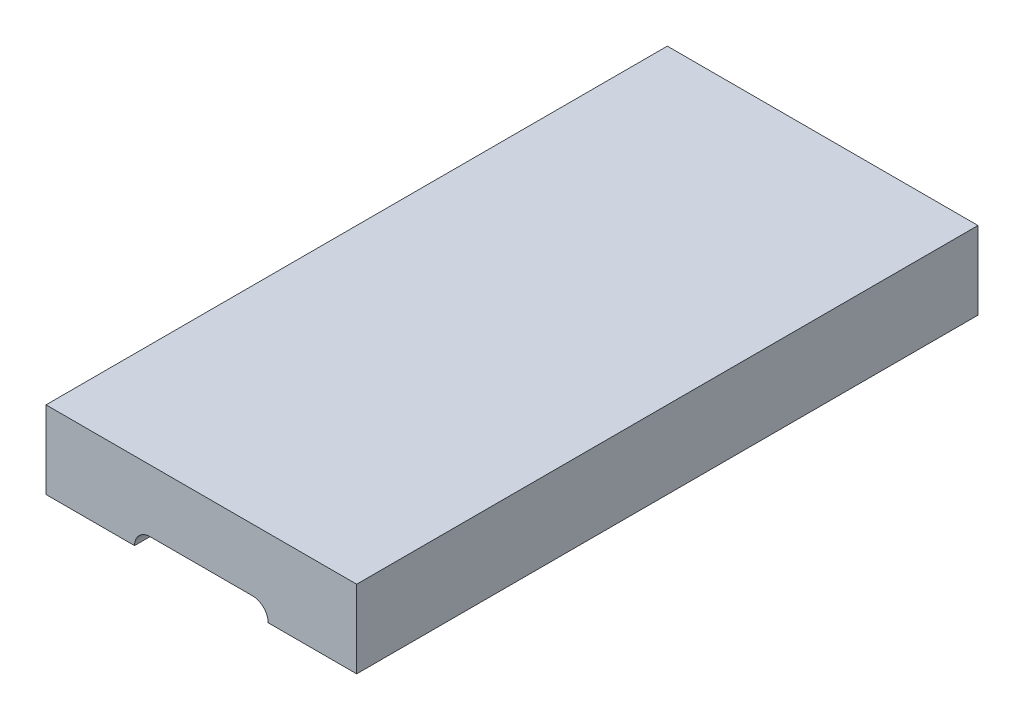
ISO-10303-21;
HEADER;
FILE_DESCRIPTION(('STEP AP214'),'2;1');
FILE_NAME('part.step','',(''),(''),'','','');
FILE_SCHEMA(('AUTOMOTIVE_DESIGN { 1 0 10303 214 1 1 1 1 }'));
ENDSEC;
DATA;
#1=APPLICATION_CONTEXT('core data for automotive mechanical design processes');
#2=APPLICATION_PROTOCOL_DEFINITION('international standard','automotive_design',2000,#1);
#3=PRODUCT_CONTEXT('',#1,'mechanical');
#4=PRODUCT('Part','Part','',(#3));
#5=PRODUCT_RELATED_PRODUCT_CATEGORY('part','',(#4));
#6=PRODUCT_DEFINITION_FORMATION('','',#4);
#7=PRODUCT_DEFINITION_CONTEXT('part definition',#1,'design');
#8=PRODUCT_DEFINITION('design','',#6,#7);
#9=PRODUCT_DEFINITION_SHAPE('','',#8);
#10=(LENGTH_UNIT() NAMED_UNIT(*) SI_UNIT(.MILLI.,.METRE.));
#11=(NAMED_UNIT(*) PLANE_ANGLE_UNIT() SI_UNIT($,.RADIAN.));
#12=(NAMED_UNIT(*) SI_UNIT($,.STERADIAN.) SOLID_ANGLE_UNIT());
#13=UNCERTAINTY_MEASURE_WITH_UNIT(LENGTH_MEASURE(1.E-05),#10,'distance_accuracy_value','');
#14=(GEOMETRIC_REPRESENTATION_CONTEXT(3) GLOBAL_UNCERTAINTY_ASSIGNED_CONTEXT((#13)) GLOBAL_UNIT_ASSIGNED_CONTEXT((#10,
#11,#12)) REPRESENTATION_CONTEXT('',''));
#15=CARTESIAN_POINT('',(0.,0.,0.));
#16=DIRECTION('',(0.,0.,1.));
#17=DIRECTION('',(1.,0.,0.));
#18=AXIS2_PLACEMENT_3D('',#15,#16,#17);
#19=CARTESIAN_POINT('',(8.509,7.62,-50.8));
#20=DIRECTION('',(0.,-1.,0.));
#21=DIRECTION('',(1.,0.,0.));
#22=AXIS2_PLACEMENT_3D('',#19,#20,#21);
#23=PLANE('',#22);
#24=DIRECTION('',(-1.,0.,0.));
#25=VECTOR('',#24,1.);
#26=CARTESIAN_POINT('',(2.54,7.62,-2.54));
#27=LINE('',#26,#25);
#28=CARTESIAN_POINT('',(16.891,7.62,-2.54));
#29=VERTEX_POINT('',#28);
#30=CARTESIAN_POINT('',(8.509,7.62,-2.54));
#31=VERTEX_POINT('',#30);
#32=EDGE_CURVE('E172',#29,#31,#27,.T.);
#33=ORIENTED_EDGE('',*,*,#32,.F.);
#34=DIRECTION('',(0.,0.,1.));
#35=VECTOR('',#34,1.);
#36=CARTESIAN_POINT('',(16.891,7.62,-50.8));
#37=LINE('',#36,#35);
#38=CARTESIAN_POINT('',(16.891,7.62,0.));
#39=VERTEX_POINT('',#38);
#40=EDGE_CURVE('E232',#29,#39,#37,.T.);
#41=ORIENTED_EDGE('',*,*,#40,.T.);
#42=DIRECTION('',(1.,0.,0.));
#43=VECTOR('',#42,1.);
#44=CARTESIAN_POINT('',(8.509,7.62,0.));
#45=LINE('',#44,#43);
#46=CARTESIAN_POINT('',(8.509,7.62,0.));
#47=VERTEX_POINT('',#46);
#48=EDGE_CURVE('E225',#47,#39,#45,.T.);
#49=ORIENTED_EDGE('',*,*,#48,.F.);
#50=DIRECTION('',(0.,0.,1.));
#51=VECTOR('',#50,1.);
#52=CARTESIAN_POINT('',(8.509,7.62,-50.8));
#53=LINE('',#52,#51);
#54=EDGE_CURVE('E248',#31,#47,#53,.T.);
#55=ORIENTED_EDGE('',*,*,#54,.F.);
#56=EDGE_LOOP('',(#33,#41,#49,#55));
#57=FACE_BOUND('',#56,.T.);
#58=ADVANCED_FACE('F38',(#57),#23,.T.);
#59=CARTESIAN_POINT('',(0.,0.,-50.8));
#60=DIRECTION('',(-1.,0.,0.));
#61=DIRECTION('',(0.,0.,1.));
#62=AXIS2_PLACEMENT_3D('',#59,#60,#61);
#63=PLANE('',#62);
#64=DIRECTION('',(0.,0.,1.));
#65=VECTOR('',#64,1.);
#66=CARTESIAN_POINT('',(0.,6.35,0.));
#67=LINE('',#66,#65);
#68=CARTESIAN_POINT('',(0.,6.35,-50.8));
#69=VERTEX_POINT('',#68);
#70=CARTESIAN_POINT('',(0.,6.35,0.));
#71=VERTEX_POINT('',#70);
#72=EDGE_CURVE('E202',#69,#71,#67,.T.);
#73=ORIENTED_EDGE('',*,*,#72,.T.);
#74=DIRECTION('',(0.,-1.,0.));
#75=VECTOR('',#74,1.);
#76=CARTESIAN_POINT('',(0.,0.,0.));
#77=LINE('',#76,#75);
#78=CARTESIAN_POINT('',(0.,12.7,0.));
#79=VERTEX_POINT('',#78);
#80=EDGE_CURVE('E247',#79,#71,#77,.T.);
#81=ORIENTED_EDGE('',*,*,#80,.F.);
#82=DIRECTION('',(0.,0.,1.));
#83=VECTOR('',#82,1.);
#84=CARTESIAN_POINT('',(0.,12.7,-50.8));
#85=LINE('',#84,#83);
#86=CARTESIAN_POINT('',(0.,12.7,-50.8));
#87=VERTEX_POINT('',#86);
#88=EDGE_CURVE('E47',#87,#79,#85,.T.);
#89=ORIENTED_EDGE('',*,*,#88,.F.);
#90=DIRECTION('',(0.,-1.,0.));
#91=VECTOR('',#90,1.);
#92=CARTESIAN_POINT('',(0.,0.,-50.8));
#93=LINE('',#92,#91);
#94=EDGE_CURVE('E254',#87,#69,#93,.T.);
#95=ORIENTED_EDGE('',*,*,#94,.T.);
#96=EDGE_LOOP('',(#73,#81,#89,#95));
#97=FACE_BOUND('',#96,.T.);
#98=ADVANCED_FACE('F40',(#97),#63,.T.);
#99=CARTESIAN_POINT('',(0.,12.7,-50.8));
#100=DIRECTION('',(0.,1.,0.));
#101=DIRECTION('',(0.,0.,1.));
#102=AXIS2_PLACEMENT_3D('',#99,#100,#101);
#103=PLANE('',#102);
#104=DIRECTION('',(-1.,0.,0.));
#105=VECTOR('',#104,1.);
#106=CARTESIAN_POINT('',(0.,12.7,0.));
#107=LINE('',#106,#105);
#108=CARTESIAN_POINT('',(25.4,12.7,0.));
#109=VERTEX_POINT('',#108);
#110=EDGE_CURVE('E259',#109,#79,#107,.T.);
#111=ORIENTED_EDGE('',*,*,#110,.F.);
#112=DIRECTION('',(0.,0.,1.));
#113=VECTOR('',#112,1.);
#114=CARTESIAN_POINT('',(25.4,12.7,-50.8));
#115=LINE('',#114,#113);
#116=CARTESIAN_POINT('',(25.4,12.7,-50.8));
#117=VERTEX_POINT('',#116);
#118=EDGE_CURVE('E266',#117,#109,#115,.T.);
#119=ORIENTED_EDGE('',*,*,#118,.F.);
#120=DIRECTION('',(-1.,0.,0.));
#121=VECTOR('',#120,1.);
#122=CARTESIAN_POINT('',(0.,12.7,-50.8));
#123=LINE('',#122,#121);
#124=EDGE_CURVE('E262',#117,#87,#123,.T.);
#125=ORIENTED_EDGE('',*,*,#124,.T.);
#126=ORIENTED_EDGE('',*,*,#88,.T.);
#127=EDGE_LOOP('',(#111,#119,#125,#126));
#128=FACE_BOUND('',#127,.T.);
#129=ADVANCED_FACE('F288',(#128),#103,.T.);
#130=CARTESIAN_POINT('',(25.4,0.,-50.8));
#131=DIRECTION('',(1.,0.,0.));
#132=DIRECTION('',(0.,0.,-1.));
#133=AXIS2_PLACEMENT_3D('',#130,#131,#132);
#134=PLANE('',#133);
#135=DIRECTION('',(0.,0.,1.));
#136=VECTOR('',#135,1.);
#137=CARTESIAN_POINT('',(25.4,6.35,0.));
#138=LINE('',#137,#136);
#139=CARTESIAN_POINT('',(25.4,6.35,-50.8));
#140=VERTEX_POINT('',#139);
#141=CARTESIAN_POINT('',(25.4,6.35,0.));
#142=VERTEX_POINT('',#141);
#143=EDGE_CURVE('E201',#140,#142,#138,.T.);
#144=ORIENTED_EDGE('',*,*,#143,.F.);
#145=DIRECTION('',(0.,1.,0.));
#146=VECTOR('',#145,1.);
#147=CARTESIAN_POINT('',(25.4,0.,-50.8));
#148=LINE('',#147,#146);
#149=EDGE_CURVE('E258',#140,#117,#148,.T.);
#150=ORIENTED_EDGE('',*,*,#149,.T.);
#151=ORIENTED_EDGE('',*,*,#118,.T.);
#152=DIRECTION('',(0.,1.,0.));
#153=VECTOR('',#152,1.);
#154=CARTESIAN_POINT('',(25.4,0.,0.));
#155=LINE('',#154,#153);
#156=EDGE_CURVE('E270',#142,#109,#155,.T.);
#157=ORIENTED_EDGE('',*,*,#156,.F.);
#158=EDGE_LOOP('',(#144,#150,#151,#157));
#159=FACE_BOUND('',#158,.T.);
#160=ADVANCED_FACE('F284',(#159),#134,.T.);
#161=CARTESIAN_POINT('',(0.,0.,-50.8));
#162=DIRECTION('',(0.,0.,-1.));
#163=DIRECTION('',(-1.,0.,0.));
#164=AXIS2_PLACEMENT_3D('',#161,#162,#163);
#165=PLANE('',#164);
#166=DIRECTION('',(1.,0.,0.));
#167=VECTOR('',#166,1.);
#168=CARTESIAN_POINT('',(0.,6.35,-50.8));
#169=LINE('',#168,#167);
#170=CARTESIAN_POINT('',(7.239,6.35,-50.8));
#171=VERTEX_POINT('',#170);
#172=EDGE_CURVE('E62',#69,#171,#169,.T.);
#173=ORIENTED_EDGE('',*,*,#172,.F.);
#174=ORIENTED_EDGE('',*,*,#94,.F.);
#175=ORIENTED_EDGE('',*,*,#124,.F.);
#176=ORIENTED_EDGE('',*,*,#149,.F.);
#177=CARTESIAN_POINT('',(18.161,6.35,-50.8));
#178=VERTEX_POINT('',#177);
#179=EDGE_CURVE('E206',#178,#140,#169,.T.);
#180=ORIENTED_EDGE('',*,*,#179,.F.);
#181=CARTESIAN_POINT('',(16.891,6.35,-50.8));
#182=DIRECTION('',(0.,0.,1.));
#183=DIRECTION('',(1.,0.,0.));
#184=AXIS2_PLACEMENT_3D('',#181,#182,#183);
#185=CIRCLE('',#184,1.27);
#186=CARTESIAN_POINT('',(16.891,7.62,-50.8));
#187=VERTEX_POINT('',#186);
#188=EDGE_CURVE('E224',#178,#187,#185,.T.);
#189=ORIENTED_EDGE('',*,*,#188,.T.);
#190=DIRECTION('',(1.,0.,0.));
#191=VECTOR('',#190,1.);
#192=CARTESIAN_POINT('',(8.509,7.62,-50.8));
#193=LINE('',#192,#191);
#194=CARTESIAN_POINT('',(8.509,7.62,-50.8));
#195=VERTEX_POINT('',#194);
#196=EDGE_CURVE('E228',#195,#187,#193,.T.);
#197=ORIENTED_EDGE('',*,*,#196,.F.);
#198=CARTESIAN_POINT('',(8.509,6.35,-50.8));
#199=DIRECTION('',(0.,0.,1.));
#200=DIRECTION('',(1.,0.,0.));
#201=AXIS2_PLACEMENT_3D('',#198,#199,#200);
#202=CIRCLE('',#201,1.27);
#203=EDGE_CURVE('E220',#195,#171,#202,.T.);
#204=ORIENTED_EDGE('',*,*,#203,.T.);
#205=EDGE_LOOP('',(#173,#174,#175,#176,#180,#189,#197,#204));
#206=FACE_BOUND('',#205,.T.);
#207=ADVANCED_FACE('F301',(#206),#165,.T.);
#208=CARTESIAN_POINT('',(0.,0.,0.));
#209=DIRECTION('',(0.,0.,-1.));
#210=DIRECTION('',(-1.,0.,0.));
#211=AXIS2_PLACEMENT_3D('',#208,#209,#210);
#212=PLANE('',#211);
#213=ORIENTED_EDGE('',*,*,#80,.T.);
#214=DIRECTION('',(1.,0.,0.));
#215=VECTOR('',#214,1.);
#216=CARTESIAN_POINT('',(0.,6.35,0.));
#217=LINE('',#216,#215);
#218=CARTESIAN_POINT('',(7.239,6.35,0.));
#219=VERTEX_POINT('',#218);
#220=EDGE_CURVE('E209',#71,#219,#217,.T.);
#221=ORIENTED_EDGE('',*,*,#220,.T.);
#222=CARTESIAN_POINT('',(8.509,6.35,0.));
#223=DIRECTION('',(0.,0.,1.));
#224=DIRECTION('',(1.,0.,0.));
#225=AXIS2_PLACEMENT_3D('',#222,#223,#224);
#226=CIRCLE('',#225,1.27);
#227=EDGE_CURVE('E219',#47,#219,#226,.T.);
#228=ORIENTED_EDGE('',*,*,#227,.F.);
#229=ORIENTED_EDGE('',*,*,#48,.T.);
#230=CARTESIAN_POINT('',(16.891,6.35,0.));
#231=DIRECTION('',(0.,0.,1.));
#232=DIRECTION('',(1.,0.,0.));
#233=AXIS2_PLACEMENT_3D('',#230,#231,#232);
#234=CIRCLE('',#233,1.27);
#235=CARTESIAN_POINT('',(18.161,6.35,0.));
#236=VERTEX_POINT('',#235);
#237=EDGE_CURVE('E236',#236,#39,#234,.T.);
#238=ORIENTED_EDGE('',*,*,#237,.F.);
#239=EDGE_CURVE('E214',#236,#142,#217,.T.);
#240=ORIENTED_EDGE('',*,*,#239,.T.);
#241=ORIENTED_EDGE('',*,*,#156,.T.);
#242=ORIENTED_EDGE('',*,*,#110,.T.);
#243=EDGE_LOOP('',(#213,#221,#228,#229,#238,#240,#241,#242));
#244=FACE_BOUND('',#243,.T.);
#245=ADVANCED_FACE('F291',(#244),#212,.F.);
#246=CARTESIAN_POINT('',(8.509,6.35,-50.8));
#247=DIRECTION('',(0.,0.,1.));
#248=DIRECTION('',(1.,0.,0.));
#249=AXIS2_PLACEMENT_3D('',#246,#247,#248);
#250=CYLINDRICAL_SURFACE('',#249,1.27);
#251=ORIENTED_EDGE('',*,*,#227,.T.);
#252=DIRECTION('',(0.,0.,1.));
#253=VECTOR('',#252,1.);
#254=CARTESIAN_POINT('',(7.239,6.35,-50.8));
#255=LINE('',#254,#253);
#256=EDGE_CURVE('E213',#219,#171,#255,.F.);
#257=ORIENTED_EDGE('',*,*,#256,.T.);
#258=ORIENTED_EDGE('',*,*,#203,.F.);
#259=CARTESIAN_POINT('',(8.509,7.62,-48.26));
#260=VERTEX_POINT('',#259);
#261=EDGE_CURVE('E243',#195,#260,#53,.T.);
#262=ORIENTED_EDGE('',*,*,#261,.T.);
#263=DIRECTION('',(0.,0.,1.));
#264=VECTOR('',#263,1.);
#265=CARTESIAN_POINT('',(8.509,7.62,-50.8));
#266=LINE('',#265,#264);
#267=EDGE_CURVE('E193',#31,#260,#266,.F.);
#268=ORIENTED_EDGE('',*,*,#267,.F.);
#269=ORIENTED_EDGE('',*,*,#54,.T.);
#270=EDGE_LOOP('',(#251,#257,#258,#262,#268,#269));
#271=FACE_BOUND('',#270,.T.);
#272=ADVANCED_FACE('F307',(#271),#250,.F.);
#273=DIRECTION('',(1.,0.,0.));
#274=VECTOR('',#273,1.);
#275=CARTESIAN_POINT('',(2.54000000000001,7.62,-48.26));
#276=LINE('',#275,#274);
#277=CARTESIAN_POINT('',(16.891,7.62,-48.26));
#278=VERTEX_POINT('',#277);
#279=EDGE_CURVE('E54',#260,#278,#276,.T.);
#280=ORIENTED_EDGE('',*,*,#279,.F.);
#281=ORIENTED_EDGE('',*,*,#261,.F.);
#282=ORIENTED_EDGE('',*,*,#196,.T.);
#283=EDGE_CURVE('E249',#187,#278,#37,.T.);
#284=ORIENTED_EDGE('',*,*,#283,.T.);
#285=EDGE_LOOP('',(#280,#281,#282,#284));
#286=FACE_BOUND('',#285,.T.);
#287=ADVANCED_FACE('F324',(#286),#23,.T.);
#288=CARTESIAN_POINT('',(16.891,6.35,-50.8));
#289=DIRECTION('',(0.,0.,1.));
#290=DIRECTION('',(1.,0.,0.));
#291=AXIS2_PLACEMENT_3D('',#288,#289,#290);
#292=CYLINDRICAL_SURFACE('',#291,1.27);
#293=ORIENTED_EDGE('',*,*,#188,.F.);
#294=DIRECTION('',(0.,0.,1.));
#295=VECTOR('',#294,1.);
#296=CARTESIAN_POINT('',(18.161,6.35,-50.8));
#297=LINE('',#296,#295);
#298=EDGE_CURVE('E11',#178,#236,#297,.T.);
#299=ORIENTED_EDGE('',*,*,#298,.T.);
#300=ORIENTED_EDGE('',*,*,#237,.T.);
#301=ORIENTED_EDGE('',*,*,#40,.F.);
#302=EDGE_CURVE('E253',#278,#29,#37,.T.);
#303=ORIENTED_EDGE('',*,*,#302,.F.);
#304=ORIENTED_EDGE('',*,*,#283,.F.);
#305=EDGE_LOOP('',(#293,#299,#300,#301,#303,#304));
#306=FACE_BOUND('',#305,.T.);
#307=ADVANCED_FACE('F320',(#306),#292,.F.);
#308=CARTESIAN_POINT('',(0.,6.35,0.));
#309=DIRECTION('',(0.,1.,0.));
#310=DIRECTION('',(0.,0.,1.));
#311=AXIS2_PLACEMENT_3D('',#308,#309,#310);
#312=PLANE('',#311);
#313=ORIENTED_EDGE('',*,*,#179,.T.);
#314=ORIENTED_EDGE('',*,*,#143,.T.);
#315=ORIENTED_EDGE('',*,*,#239,.F.);
#316=ORIENTED_EDGE('',*,*,#298,.F.);
#317=EDGE_LOOP('',(#313,#314,#315,#316));
#318=FACE_BOUND('',#317,.T.);
#319=ADVANCED_FACE('F298',(#318),#312,.F.);
#320=ORIENTED_EDGE('',*,*,#220,.F.);
#321=ORIENTED_EDGE('',*,*,#72,.F.);
#322=ORIENTED_EDGE('',*,*,#172,.T.);
#323=ORIENTED_EDGE('',*,*,#256,.F.);
#324=EDGE_LOOP('',(#320,#321,#322,#323));
#325=FACE_BOUND('',#324,.T.);
#326=ADVANCED_FACE('F304',(#325),#312,.F.);
#327=CARTESIAN_POINT('',(0.,7.62,0.));
#328=DIRECTION('',(0.,-1.,0.));
#329=DIRECTION('',(1.,0.,0.));
#330=AXIS2_PLACEMENT_3D('',#327,#328,#329);
#331=PLANE('',#330);
#332=CARTESIAN_POINT('',(22.86,7.62,-2.54));
#333=VERTEX_POINT('',#332);
#334=EDGE_CURVE('E168',#333,#29,#27,.T.);
#335=ORIENTED_EDGE('',*,*,#334,.F.);
#336=DIRECTION('',(0.,0.,1.));
#337=VECTOR('',#336,1.);
#338=CARTESIAN_POINT('',(22.86,7.62,-2.54));
#339=LINE('',#338,#337);
#340=CARTESIAN_POINT('',(22.86,7.62,-48.26));
#341=VERTEX_POINT('',#340);
#342=EDGE_CURVE('E186',#341,#333,#339,.T.);
#343=ORIENTED_EDGE('',*,*,#342,.F.);
#344=EDGE_CURVE('E182',#278,#341,#276,.T.);
#345=ORIENTED_EDGE('',*,*,#344,.F.);
#346=ORIENTED_EDGE('',*,*,#302,.T.);
#347=EDGE_LOOP('',(#335,#343,#345,#346));
#348=FACE_BOUND('',#347,.T.);
#349=ADVANCED_FACE('F332',(#348),#331,.F.);
#350=CARTESIAN_POINT('',(2.54,11.43,-2.54));
#351=DIRECTION('',(-1.,0.,0.));
#352=DIRECTION('',(0.,-1.,0.));
#353=AXIS2_PLACEMENT_3D('',#350,#351,#352);
#354=PLANE('',#353);
#355=DIRECTION('',(0.,0.,-1.));
#356=VECTOR('',#355,1.);
#357=CARTESIAN_POINT('',(2.54,7.62,-2.54));
#358=LINE('',#357,#356);
#359=CARTESIAN_POINT('',(2.54,7.62,-2.54));
#360=VERTEX_POINT('',#359);
#361=CARTESIAN_POINT('',(2.54000000000001,7.62,-48.26));
#362=VERTEX_POINT('',#361);
#363=EDGE_CURVE('E149',#360,#362,#358,.T.);
#364=ORIENTED_EDGE('',*,*,#363,.T.);
#365=DIRECTION('',(0.,-1.,0.));
#366=VECTOR('',#365,1.);
#367=CARTESIAN_POINT('',(2.54,11.43,-48.26));
#368=LINE('',#367,#366);
#369=CARTESIAN_POINT('',(2.54,11.43,-48.26));
#370=VERTEX_POINT('',#369);
#371=EDGE_CURVE('E141',#370,#362,#368,.T.);
#372=ORIENTED_EDGE('',*,*,#371,.F.);
#373=DIRECTION('',(0.,0.,-1.));
#374=VECTOR('',#373,1.);
#375=CARTESIAN_POINT('',(2.54,11.43,-2.54));
#376=LINE('',#375,#374);
#377=CARTESIAN_POINT('',(2.54,11.43,-2.54));
#378=VERTEX_POINT('',#377);
#379=EDGE_CURVE('E146',#378,#370,#376,.T.);
#380=ORIENTED_EDGE('',*,*,#379,.F.);
#381=DIRECTION('',(0.,-1.,0.));
#382=VECTOR('',#381,1.);
#383=CARTESIAN_POINT('',(2.54,11.43,-2.54));
#384=LINE('',#383,#382);
#385=EDGE_CURVE('E190',#378,#360,#384,.T.);
#386=ORIENTED_EDGE('',*,*,#385,.T.);
#387=EDGE_LOOP('',(#364,#372,#380,#386));
#388=FACE_BOUND('',#387,.T.);
#389=ADVANCED_FACE('F143',(#388),#354,.F.);
#390=CARTESIAN_POINT('',(2.54,11.43,-2.54));
#391=DIRECTION('',(0.,0.,1.));
#392=DIRECTION('',(1.,0.,0.));
#393=AXIS2_PLACEMENT_3D('',#390,#391,#392);
#394=PLANE('',#393);
#395=ORIENTED_EDGE('',*,*,#334,.T.);
#396=ORIENTED_EDGE('',*,*,#32,.T.);
#397=EDGE_CURVE('E174',#31,#360,#27,.T.);
#398=ORIENTED_EDGE('',*,*,#397,.T.);
#399=ORIENTED_EDGE('',*,*,#385,.F.);
#400=DIRECTION('',(-1.,0.,0.));
#401=VECTOR('',#400,1.);
#402=CARTESIAN_POINT('',(2.54,11.43,-2.54));
#403=LINE('',#402,#401);
#404=CARTESIAN_POINT('',(22.86,11.43,-2.54));
#405=VERTEX_POINT('',#404);
#406=EDGE_CURVE('E153',#405,#378,#403,.T.);
#407=ORIENTED_EDGE('',*,*,#406,.F.);
#408=DIRECTION('',(0.,-1.,0.));
#409=VECTOR('',#408,1.);
#410=CARTESIAN_POINT('',(22.86,11.43,-2.54));
#411=LINE('',#410,#409);
#412=EDGE_CURVE('E194',#405,#333,#411,.T.);
#413=ORIENTED_EDGE('',*,*,#412,.T.);
#414=EDGE_LOOP('',(#395,#396,#398,#399,#407,#413));
#415=FACE_BOUND('',#414,.T.);
#416=ADVANCED_FACE('F334',(#415),#394,.F.);
#417=CARTESIAN_POINT('',(22.86,11.43,-2.54));
#418=DIRECTION('',(1.,0.,0.));
#419=DIRECTION('',(0.,1.,0.));
#420=AXIS2_PLACEMENT_3D('',#417,#418,#419);
#421=PLANE('',#420);
#422=ORIENTED_EDGE('',*,*,#342,.T.);
#423=ORIENTED_EDGE('',*,*,#412,.F.);
#424=DIRECTION('',(0.,0.,1.));
#425=VECTOR('',#424,1.);
#426=CARTESIAN_POINT('',(22.86,11.43,-2.54));
#427=LINE('',#426,#425);
#428=CARTESIAN_POINT('',(22.86,11.43,-48.26));
#429=VERTEX_POINT('',#428);
#430=EDGE_CURVE('E163',#429,#405,#427,.T.);
#431=ORIENTED_EDGE('',*,*,#430,.F.);
#432=DIRECTION('',(0.,-1.,0.));
#433=VECTOR('',#432,1.);
#434=CARTESIAN_POINT('',(22.86,11.43,-48.26));
#435=LINE('',#434,#433);
#436=EDGE_CURVE('E152',#429,#341,#435,.T.);
#437=ORIENTED_EDGE('',*,*,#436,.T.);
#438=EDGE_LOOP('',(#422,#423,#431,#437));
#439=FACE_BOUND('',#438,.T.);
#440=ADVANCED_FACE('F330',(#439),#421,.F.);
#441=CARTESIAN_POINT('',(2.54,11.43,-48.26));
#442=DIRECTION('',(0.,0.,-1.));
#443=DIRECTION('',(-1.,0.,0.));
#444=AXIS2_PLACEMENT_3D('',#441,#442,#443);
#445=PLANE('',#444);
#446=EDGE_CURVE('E183',#362,#260,#276,.T.);
#447=ORIENTED_EDGE('',*,*,#446,.T.);
#448=ORIENTED_EDGE('',*,*,#279,.T.);
#449=ORIENTED_EDGE('',*,*,#344,.T.);
#450=ORIENTED_EDGE('',*,*,#436,.F.);
#451=DIRECTION('',(1.,0.,0.));
#452=VECTOR('',#451,1.);
#453=CARTESIAN_POINT('',(2.54,11.43,-48.26));
#454=LINE('',#453,#452);
#455=EDGE_CURVE('E156',#370,#429,#454,.T.);
#456=ORIENTED_EDGE('',*,*,#455,.F.);
#457=ORIENTED_EDGE('',*,*,#371,.T.);
#458=EDGE_LOOP('',(#447,#448,#449,#450,#456,#457));
#459=FACE_BOUND('',#458,.T.);
#460=ADVANCED_FACE('F157',(#459),#445,.F.);
#461=CARTESIAN_POINT('',(0.,11.43,0.));
#462=DIRECTION('',(0.,-1.,0.));
#463=DIRECTION('',(1.,0.,0.));
#464=AXIS2_PLACEMENT_3D('',#461,#462,#463);
#465=PLANE('',#464);
#466=ORIENTED_EDGE('',*,*,#379,.T.);
#467=ORIENTED_EDGE('',*,*,#455,.T.);
#468=ORIENTED_EDGE('',*,*,#430,.T.);
#469=ORIENTED_EDGE('',*,*,#406,.T.);
#470=EDGE_LOOP('',(#466,#467,#468,#469));
#471=FACE_BOUND('',#470,.T.);
#472=ADVANCED_FACE('F165',(#471),#465,.T.);
#473=ORIENTED_EDGE('',*,*,#267,.T.);
#474=ORIENTED_EDGE('',*,*,#446,.F.);
#475=ORIENTED_EDGE('',*,*,#363,.F.);
#476=ORIENTED_EDGE('',*,*,#397,.F.);
#477=EDGE_LOOP('',(#473,#474,#475,#476));
#478=FACE_BOUND('',#477,.T.);
#479=ADVANCED_FACE('F336',(#478),#331,.F.);
#480=CLOSED_SHELL('',(#58,#98,#129,#160,#207,#245,#272,#287,#307,#319,#326,#349,#389,#416,#440,
#460,#472,#479));
#481=MANIFOLD_SOLID_BREP('B2',#480);
#482=ADVANCED_BREP_SHAPE_REPRESENTATION('',(#18,#481),#14);
#483=SHAPE_DEFINITION_REPRESENTATION(#9,#482);
ENDSEC;
END-ISO-10303-21;
